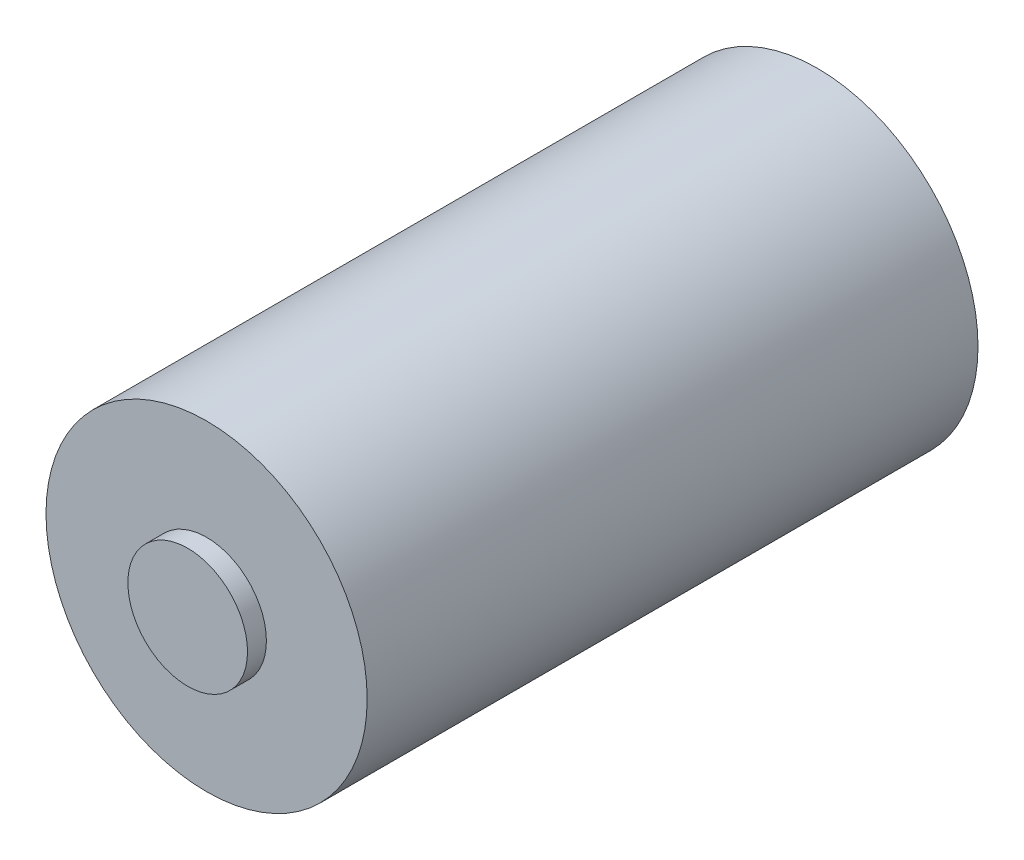
ISO-10303-21;
HEADER;
FILE_DESCRIPTION(('STEP AP214'),'2;1');
FILE_NAME('part.step','',(''),(''),'','','');
FILE_SCHEMA(('AUTOMOTIVE_DESIGN { 1 0 10303 214 1 1 1 1 }'));
ENDSEC;
DATA;
#1=APPLICATION_CONTEXT('core data for automotive mechanical design processes');
#2=APPLICATION_PROTOCOL_DEFINITION('international standard','automotive_design',2000,#1);
#3=PRODUCT_CONTEXT('',#1,'mechanical');
#4=PRODUCT('Part','Part','',(#3));
#5=PRODUCT_RELATED_PRODUCT_CATEGORY('part','',(#4));
#6=PRODUCT_DEFINITION_FORMATION('','',#4);
#7=PRODUCT_DEFINITION_CONTEXT('part definition',#1,'design');
#8=PRODUCT_DEFINITION('design','',#6,#7);
#9=PRODUCT_DEFINITION_SHAPE('','',#8);
#10=(LENGTH_UNIT() NAMED_UNIT(*) SI_UNIT(.MILLI.,.METRE.));
#11=(NAMED_UNIT(*) PLANE_ANGLE_UNIT() SI_UNIT($,.RADIAN.));
#12=(NAMED_UNIT(*) SI_UNIT($,.STERADIAN.) SOLID_ANGLE_UNIT());
#13=UNCERTAINTY_MEASURE_WITH_UNIT(LENGTH_MEASURE(1.E-05),#10,'distance_accuracy_value','');
#14=(GEOMETRIC_REPRESENTATION_CONTEXT(3) GLOBAL_UNCERTAINTY_ASSIGNED_CONTEXT((#13)) GLOBAL_UNIT_ASSIGNED_CONTEXT((#10,
#11,#12)) REPRESENTATION_CONTEXT('',''));
#15=CARTESIAN_POINT('',(0.,0.,0.));
#16=DIRECTION('',(0.,0.,1.));
#17=DIRECTION('',(1.,0.,0.));
#18=AXIS2_PLACEMENT_3D('',#15,#16,#17);
#19=CARTESIAN_POINT('',(0.,0.,50.));
#20=DIRECTION('',(0.,0.,-1.));
#21=DIRECTION('',(-1.,0.,0.));
#22=AXIS2_PLACEMENT_3D('',#19,#20,#21);
#23=CYLINDRICAL_SURFACE('',#22,12.75);
#24=CARTESIAN_POINT('',(0.,0.,0.));
#25=DIRECTION('',(0.,0.,1.));
#26=DIRECTION('',(1.,0.,0.));
#27=AXIS2_PLACEMENT_3D('',#24,#25,#26);
#28=CIRCLE('',#27,12.75);
#29=CARTESIAN_POINT('',(12.75,0.,0.));
#30=VERTEX_POINT('',#29);
#31=EDGE_CURVE('E127',#30,#30,#28,.T.);
#32=ORIENTED_EDGE('',*,*,#31,.T.);
#33=EDGE_LOOP('',(#32));
#34=FACE_BOUND('',#33,.T.);
#35=CARTESIAN_POINT('',(0.,0.,48.5));
#36=DIRECTION('',(0.,0.,1.));
#37=DIRECTION('',(1.,0.,0.));
#38=AXIS2_PLACEMENT_3D('',#35,#36,#37);
#39=CIRCLE('',#38,12.75);
#40=CARTESIAN_POINT('',(12.75,0.,48.5));
#41=VERTEX_POINT('',#40);
#42=EDGE_CURVE('E132',#41,#41,#39,.T.);
#43=ORIENTED_EDGE('',*,*,#42,.F.);
#44=EDGE_LOOP('',(#43));
#45=FACE_BOUND('',#44,.T.);
#46=CARTESIAN_POINT('',(0.,0.,3.94677194649578));
#47=DIRECTION('',(0.,0.,-1.));
#48=DIRECTION('',(0.108785231285917,-0.994065276254064,0.));
#49=AXIS2_PLACEMENT_3D('',#46,#47,#48);
#50=CIRCLE('',#49,12.75);
#51=CARTESIAN_POINT('',(3.1873253174934,-12.3451795175471,3.94677194649578));
#52=VERTEX_POINT('',#51);
#53=CARTESIAN_POINT('',(1.38701169889545,-12.6743322722393,3.94677194649578));
#54=VERTEX_POINT('',#53);
#55=EDGE_CURVE('E122',#52,#54,#50,.T.);
#56=ORIENTED_EDGE('',*,*,#55,.T.);
#57=DIRECTION('',(0.,0.,1.));
#58=VECTOR('',#57,1.);
#59=CARTESIAN_POINT('',(1.38701169889546,-12.6743322722393,3.94677194649578));
#60=LINE('',#59,#58);
#61=CARTESIAN_POINT('',(1.38701169889546,-12.6743322722393,4.43523348495732));
#62=VERTEX_POINT('',#61);
#63=EDGE_CURVE('E13',#54,#62,#60,.T.);
#64=ORIENTED_EDGE('',*,*,#63,.T.);
#65=CARTESIAN_POINT('',(0.,0.,4.43523348495732));
#66=DIRECTION('',(0.,0.,-1.));
#67=DIRECTION('',(0.108785231285918,-0.994065276254064,0.));
#68=AXIS2_PLACEMENT_3D('',#65,#66,#67);
#69=CIRCLE('',#68,12.75);
#70=CARTESIAN_POINT('',(3.1873253174934,-12.3451795175471,4.43523348495732));
#71=VERTEX_POINT('',#70);
#72=EDGE_CURVE('E107',#71,#62,#69,.T.);
#73=ORIENTED_EDGE('',*,*,#72,.F.);
#74=DIRECTION('',(0.,0.,-1.));
#75=VECTOR('',#74,1.);
#76=CARTESIAN_POINT('',(3.1873253174934,-12.3451795175471,4.43523348495732));
#77=LINE('',#76,#75);
#78=EDGE_CURVE('E120',#71,#52,#77,.T.);
#79=ORIENTED_EDGE('',*,*,#78,.T.);
#80=EDGE_LOOP('',(#56,#64,#73,#79));
#81=FACE_BOUND('',#80,.T.);
#82=ADVANCED_FACE('F98',(#34,#45,#81),#23,.T.);
#83=ORIENTED_EDGE('',*,*,#63,.F.);
#84=ORIENTED_EDGE('',*,*,#55,.F.);
#85=ORIENTED_EDGE('',*,*,#78,.F.);
#86=ORIENTED_EDGE('',*,*,#72,.T.);
#87=EDGE_LOOP('',(#83,#84,#85,#86));
#88=FACE_BOUND('',#87,.T.);
#89=ADVANCED_FACE('F100',(#88),#23,.T.);
#90=CARTESIAN_POINT('',(0.,0.,0.));
#91=DIRECTION('',(0.,0.,1.));
#92=DIRECTION('',(1.,0.,0.));
#93=AXIS2_PLACEMENT_3D('',#90,#91,#92);
#94=PLANE('',#93);
#95=ORIENTED_EDGE('',*,*,#31,.F.);
#96=EDGE_LOOP('',(#95));
#97=FACE_BOUND('',#96,.T.);
#98=ADVANCED_FACE('F157',(#97),#94,.F.);
#99=CARTESIAN_POINT('',(0.,0.,48.5));
#100=DIRECTION('',(0.,0.,1.));
#101=DIRECTION('',(1.,0.,0.));
#102=AXIS2_PLACEMENT_3D('',#99,#100,#101);
#103=PLANE('',#102);
#104=CARTESIAN_POINT('',(0.,0.,48.5));
#105=DIRECTION('',(0.,0.,1.));
#106=DIRECTION('',(1.,0.,0.));
#107=AXIS2_PLACEMENT_3D('',#104,#105,#106);
#108=CIRCLE('',#107,4.75);
#109=CARTESIAN_POINT('',(4.75,0.,48.5));
#110=VERTEX_POINT('',#109);
#111=EDGE_CURVE('E144',#110,#110,#108,.T.);
#112=ORIENTED_EDGE('',*,*,#111,.F.);
#113=EDGE_LOOP('',(#112));
#114=FACE_BOUND('',#113,.T.);
#115=ORIENTED_EDGE('',*,*,#42,.T.);
#116=EDGE_LOOP('',(#115));
#117=FACE_BOUND('',#116,.T.);
#118=ADVANCED_FACE('F154',(#114,#117),#103,.T.);
#119=CARTESIAN_POINT('',(0.,0.,48.5));
#120=DIRECTION('',(0.,0.,1.));
#121=DIRECTION('',(1.,0.,0.));
#122=AXIS2_PLACEMENT_3D('',#119,#120,#121);
#123=CYLINDRICAL_SURFACE('',#122,4.75);
#124=ORIENTED_EDGE('',*,*,#111,.T.);
#125=EDGE_LOOP('',(#124));
#126=FACE_BOUND('',#125,.T.);
#127=CARTESIAN_POINT('',(0.,0.,50.));
#128=DIRECTION('',(0.,0.,1.));
#129=DIRECTION('',(1.,0.,0.));
#130=AXIS2_PLACEMENT_3D('',#127,#128,#129);
#131=CIRCLE('',#130,4.75);
#132=CARTESIAN_POINT('',(4.75,0.,50.));
#133=VERTEX_POINT('',#132);
#134=EDGE_CURVE('E145',#133,#133,#131,.T.);
#135=ORIENTED_EDGE('',*,*,#134,.F.);
#136=EDGE_LOOP('',(#135));
#137=FACE_BOUND('',#136,.T.);
#138=ADVANCED_FACE('F151',(#126,#137),#123,.T.);
#139=CARTESIAN_POINT('',(0.,0.,50.));
#140=DIRECTION('',(0.,0.,1.));
#141=DIRECTION('',(1.,0.,0.));
#142=AXIS2_PLACEMENT_3D('',#139,#140,#141);
#143=PLANE('',#142);
#144=ORIENTED_EDGE('',*,*,#134,.T.);
#145=EDGE_LOOP('',(#144));
#146=FACE_BOUND('',#145,.T.);
#147=ADVANCED_FACE('F172',(#146),#143,.T.);
#148=CLOSED_SHELL('',(#82,#89,#98,#118,#138,#147));
#149=MANIFOLD_SOLID_BREP('B2',#148);
#150=ADVANCED_BREP_SHAPE_REPRESENTATION('',(#18,#149),#14);
#151=SHAPE_DEFINITION_REPRESENTATION(#9,#150);
ENDSEC;
END-ISO-10303-21;
